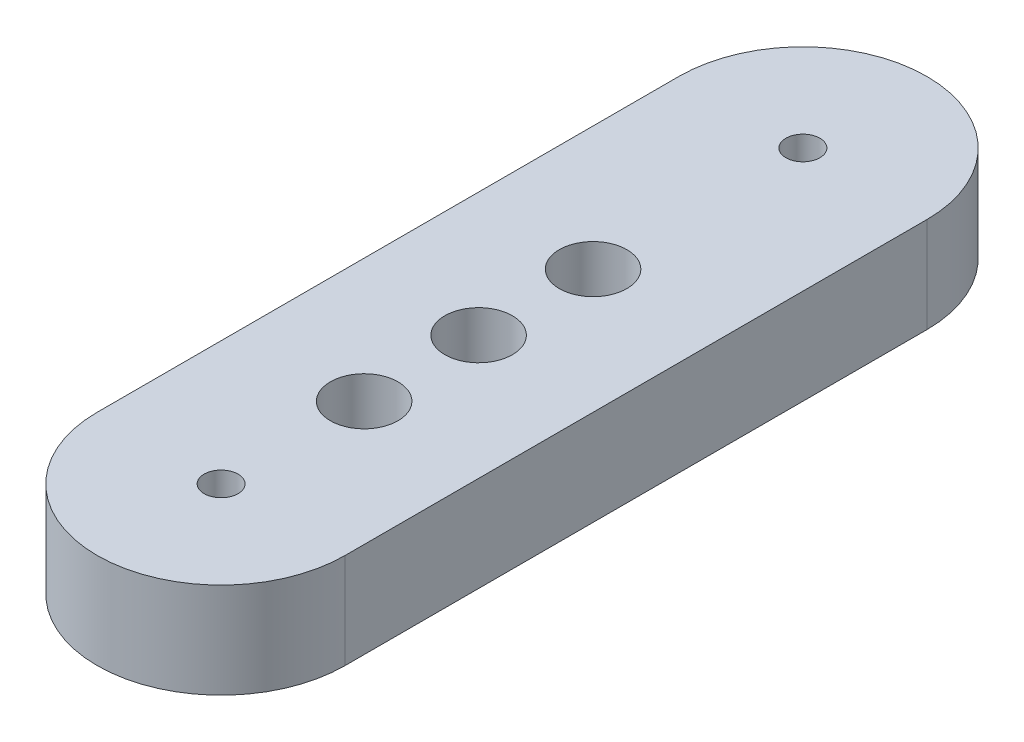
ISO-10303-21;
HEADER;
FILE_DESCRIPTION(('STEP AP214'),'2;1');
FILE_NAME('part.step','',(''),(''),'','','');
FILE_SCHEMA(('AUTOMOTIVE_DESIGN { 1 0 10303 214 1 1 1 1 }'));
ENDSEC;
DATA;
#1=APPLICATION_CONTEXT('core data for automotive mechanical design processes');
#2=APPLICATION_PROTOCOL_DEFINITION('international standard','automotive_design',2000,#1);
#3=PRODUCT_CONTEXT('',#1,'mechanical');
#4=PRODUCT('Part','Part','',(#3));
#5=PRODUCT_RELATED_PRODUCT_CATEGORY('part','',(#4));
#6=PRODUCT_DEFINITION_FORMATION('','',#4);
#7=PRODUCT_DEFINITION_CONTEXT('part definition',#1,'design');
#8=PRODUCT_DEFINITION('design','',#6,#7);
#9=PRODUCT_DEFINITION_SHAPE('','',#8);
#10=(LENGTH_UNIT() NAMED_UNIT(*) SI_UNIT(.MILLI.,.METRE.));
#11=(NAMED_UNIT(*) PLANE_ANGLE_UNIT() SI_UNIT($,.RADIAN.));
#12=(NAMED_UNIT(*) SI_UNIT($,.STERADIAN.) SOLID_ANGLE_UNIT());
#13=UNCERTAINTY_MEASURE_WITH_UNIT(LENGTH_MEASURE(1.E-05),#10,'distance_accuracy_value','');
#14=(GEOMETRIC_REPRESENTATION_CONTEXT(3) GLOBAL_UNCERTAINTY_ASSIGNED_CONTEXT((#13)) GLOBAL_UNIT_ASSIGNED_CONTEXT((#10,
#11,#12)) REPRESENTATION_CONTEXT('',''));
#15=CARTESIAN_POINT('',(0.,0.,0.));
#16=DIRECTION('',(0.,0.,1.));
#17=DIRECTION('',(1.,0.,0.));
#18=AXIS2_PLACEMENT_3D('',#15,#16,#17);
#19=CARTESIAN_POINT('',(0.,6.35,19.3675));
#20=DIRECTION('',(0.,1.,0.));
#21=DIRECTION('',(0.,0.,1.));
#22=AXIS2_PLACEMENT_3D('',#19,#20,#21);
#23=PLANE('',#22);
#24=CARTESIAN_POINT('',(0.,6.35,2.2225));
#25=DIRECTION('',(0.,1.,0.));
#26=DIRECTION('',(0.,0.,1.));
#27=AXIS2_PLACEMENT_3D('',#24,#25,#26);
#28=CIRCLE('',#27,2.25);
#29=CARTESIAN_POINT('',(0.,6.35,4.4725));
#30=VERTEX_POINT('',#29);
#31=EDGE_CURVE('E127',#30,#30,#28,.T.);
#32=ORIENTED_EDGE('',*,*,#31,.F.);
#33=EDGE_LOOP('',(#32));
#34=FACE_BOUND('',#33,.T.);
#35=CARTESIAN_POINT('',(0.,6.35,19.3675));
#36=DIRECTION('',(0.,1.,0.));
#37=DIRECTION('',(0.,0.,1.));
#38=AXIS2_PLACEMENT_3D('',#35,#36,#37);
#39=CIRCLE('',#38,1.1303);
#40=CARTESIAN_POINT('',(0.,6.35,20.4978));
#41=VERTEX_POINT('',#40);
#42=EDGE_CURVE('E115',#41,#41,#39,.T.);
#43=ORIENTED_EDGE('',*,*,#42,.F.);
#44=EDGE_LOOP('',(#43));
#45=FACE_BOUND('',#44,.T.);
#46=CARTESIAN_POINT('',(0.,6.35,19.3675));
#47=DIRECTION('',(0.,1.,0.));
#48=DIRECTION('',(0.,0.,1.));
#49=AXIS2_PLACEMENT_3D('',#46,#47,#48);
#50=CIRCLE('',#49,8.255);
#51=CARTESIAN_POINT('',(-8.255,6.35,19.3675));
#52=VERTEX_POINT('',#51);
#53=CARTESIAN_POINT('',(8.255,6.35,19.3675));
#54=VERTEX_POINT('',#53);
#55=EDGE_CURVE('E85',#52,#54,#50,.T.);
#56=ORIENTED_EDGE('',*,*,#55,.T.);
#57=DIRECTION('',(0.,0.,-1.));
#58=VECTOR('',#57,1.);
#59=CARTESIAN_POINT('',(8.255,6.35,19.3675));
#60=LINE('',#59,#58);
#61=CARTESIAN_POINT('',(8.255,6.35,-19.3675));
#62=VERTEX_POINT('',#61);
#63=EDGE_CURVE('E80',#54,#62,#60,.T.);
#64=ORIENTED_EDGE('',*,*,#63,.T.);
#65=CARTESIAN_POINT('',(0.,6.35,-19.3675));
#66=DIRECTION('',(0.,1.,0.));
#67=DIRECTION('',(0.,0.,1.));
#68=AXIS2_PLACEMENT_3D('',#65,#66,#67);
#69=CIRCLE('',#68,8.255);
#70=CARTESIAN_POINT('',(-8.25500000000001,6.35,-19.3675));
#71=VERTEX_POINT('',#70);
#72=EDGE_CURVE('E83',#62,#71,#69,.T.);
#73=ORIENTED_EDGE('',*,*,#72,.T.);
#74=DIRECTION('',(0.,0.,1.));
#75=VECTOR('',#74,1.);
#76=CARTESIAN_POINT('',(-8.255,6.35,19.3675));
#77=LINE('',#76,#75);
#78=EDGE_CURVE('E50',#71,#52,#77,.T.);
#79=ORIENTED_EDGE('',*,*,#78,.T.);
#80=EDGE_LOOP('',(#56,#64,#73,#79));
#81=FACE_BOUND('',#80,.T.);
#82=CARTESIAN_POINT('',(0.,6.35,-19.3675));
#83=DIRECTION('',(0.,1.,0.));
#84=DIRECTION('',(0.,0.,1.));
#85=AXIS2_PLACEMENT_3D('',#82,#83,#84);
#86=CIRCLE('',#85,1.1303);
#87=CARTESIAN_POINT('',(0.,6.35,-18.2372));
#88=VERTEX_POINT('',#87);
#89=EDGE_CURVE('E100',#88,#88,#86,.T.);
#90=ORIENTED_EDGE('',*,*,#89,.F.);
#91=EDGE_LOOP('',(#90));
#92=FACE_BOUND('',#91,.T.);
#93=CARTESIAN_POINT('',(0.,6.35,9.8425));
#94=DIRECTION('',(0.,1.,0.));
#95=DIRECTION('',(0.,0.,1.));
#96=AXIS2_PLACEMENT_3D('',#93,#94,#95);
#97=CIRCLE('',#96,2.25);
#98=CARTESIAN_POINT('',(0.,6.35,12.0925));
#99=VERTEX_POINT('',#98);
#100=EDGE_CURVE('E121',#99,#99,#97,.T.);
#101=ORIENTED_EDGE('',*,*,#100,.F.);
#102=EDGE_LOOP('',(#101));
#103=FACE_BOUND('',#102,.T.);
#104=CARTESIAN_POINT('',(0.,6.35,-5.3975));
#105=DIRECTION('',(0.,1.,0.));
#106=DIRECTION('',(0.,0.,1.));
#107=AXIS2_PLACEMENT_3D('',#104,#105,#106);
#108=CIRCLE('',#107,2.25);
#109=CARTESIAN_POINT('',(0.,6.35,-3.1475));
#110=VERTEX_POINT('',#109);
#111=EDGE_CURVE('E133',#110,#110,#108,.T.);
#112=ORIENTED_EDGE('',*,*,#111,.F.);
#113=EDGE_LOOP('',(#112));
#114=FACE_BOUND('',#113,.T.);
#115=ADVANCED_FACE('F33',(#34,#45,#81,#92,#103,#114),#23,.T.);
#116=CARTESIAN_POINT('',(0.,0.,19.3675));
#117=DIRECTION('',(0.,1.,0.));
#118=DIRECTION('',(0.,0.,1.));
#119=AXIS2_PLACEMENT_3D('',#116,#117,#118);
#120=PLANE('',#119);
#121=CARTESIAN_POINT('',(0.,0.,2.2225));
#122=DIRECTION('',(0.,1.,0.));
#123=DIRECTION('',(0.,0.,1.));
#124=AXIS2_PLACEMENT_3D('',#121,#122,#123);
#125=CIRCLE('',#124,2.25);
#126=CARTESIAN_POINT('',(0.,0.,4.4725));
#127=VERTEX_POINT('',#126);
#128=EDGE_CURVE('E130',#127,#127,#125,.T.);
#129=ORIENTED_EDGE('',*,*,#128,.T.);
#130=EDGE_LOOP('',(#129));
#131=FACE_BOUND('',#130,.T.);
#132=CARTESIAN_POINT('',(0.,0.,19.3675));
#133=DIRECTION('',(0.,1.,0.));
#134=DIRECTION('',(0.,0.,1.));
#135=AXIS2_PLACEMENT_3D('',#132,#133,#134);
#136=CIRCLE('',#135,1.1303);
#137=CARTESIAN_POINT('',(0.,0.,20.4978));
#138=VERTEX_POINT('',#137);
#139=EDGE_CURVE('E118',#138,#138,#136,.T.);
#140=ORIENTED_EDGE('',*,*,#139,.T.);
#141=EDGE_LOOP('',(#140));
#142=FACE_BOUND('',#141,.T.);
#143=CARTESIAN_POINT('',(0.,0.,19.3675));
#144=DIRECTION('',(0.,1.,0.));
#145=DIRECTION('',(0.,0.,1.));
#146=AXIS2_PLACEMENT_3D('',#143,#144,#145);
#147=CIRCLE('',#146,8.255);
#148=CARTESIAN_POINT('',(-8.255,0.,19.3675));
#149=VERTEX_POINT('',#148);
#150=CARTESIAN_POINT('',(8.255,0.,19.3675));
#151=VERTEX_POINT('',#150);
#152=EDGE_CURVE('E97',#149,#151,#147,.T.);
#153=ORIENTED_EDGE('',*,*,#152,.F.);
#154=DIRECTION('',(0.,0.,1.));
#155=VECTOR('',#154,1.);
#156=CARTESIAN_POINT('',(-8.255,0.,19.3675));
#157=LINE('',#156,#155);
#158=CARTESIAN_POINT('',(-8.25500000000001,0.,-19.3675));
#159=VERTEX_POINT('',#158);
#160=EDGE_CURVE('E73',#159,#149,#157,.T.);
#161=ORIENTED_EDGE('',*,*,#160,.F.);
#162=CARTESIAN_POINT('',(0.,0.,-19.3675));
#163=DIRECTION('',(0.,1.,0.));
#164=DIRECTION('',(0.,0.,1.));
#165=AXIS2_PLACEMENT_3D('',#162,#163,#164);
#166=CIRCLE('',#165,8.255);
#167=CARTESIAN_POINT('',(8.255,0.,-19.3675));
#168=VERTEX_POINT('',#167);
#169=EDGE_CURVE('E67',#168,#159,#166,.T.);
#170=ORIENTED_EDGE('',*,*,#169,.F.);
#171=DIRECTION('',(0.,0.,-1.));
#172=VECTOR('',#171,1.);
#173=CARTESIAN_POINT('',(8.255,0.,19.3675));
#174=LINE('',#173,#172);
#175=EDGE_CURVE('E89',#151,#168,#174,.T.);
#176=ORIENTED_EDGE('',*,*,#175,.F.);
#177=EDGE_LOOP('',(#153,#161,#170,#176));
#178=FACE_BOUND('',#177,.T.);
#179=CARTESIAN_POINT('',(0.,0.,-19.3675));
#180=DIRECTION('',(0.,1.,0.));
#181=DIRECTION('',(0.,0.,1.));
#182=AXIS2_PLACEMENT_3D('',#179,#180,#181);
#183=CIRCLE('',#182,1.1303);
#184=CARTESIAN_POINT('',(0.,0.,-18.2372));
#185=VERTEX_POINT('',#184);
#186=EDGE_CURVE('E112',#185,#185,#183,.T.);
#187=ORIENTED_EDGE('',*,*,#186,.T.);
#188=EDGE_LOOP('',(#187));
#189=FACE_BOUND('',#188,.T.);
#190=CARTESIAN_POINT('',(0.,0.,9.8425));
#191=DIRECTION('',(0.,1.,0.));
#192=DIRECTION('',(0.,0.,1.));
#193=AXIS2_PLACEMENT_3D('',#190,#191,#192);
#194=CIRCLE('',#193,2.25);
#195=CARTESIAN_POINT('',(0.,0.,12.0925));
#196=VERTEX_POINT('',#195);
#197=EDGE_CURVE('E124',#196,#196,#194,.T.);
#198=ORIENTED_EDGE('',*,*,#197,.T.);
#199=EDGE_LOOP('',(#198));
#200=FACE_BOUND('',#199,.T.);
#201=CARTESIAN_POINT('',(0.,0.,-5.3975));
#202=DIRECTION('',(0.,1.,0.));
#203=DIRECTION('',(0.,0.,1.));
#204=AXIS2_PLACEMENT_3D('',#201,#202,#203);
#205=CIRCLE('',#204,2.25);
#206=CARTESIAN_POINT('',(0.,0.,-3.1475));
#207=VERTEX_POINT('',#206);
#208=EDGE_CURVE('E136',#207,#207,#205,.T.);
#209=ORIENTED_EDGE('',*,*,#208,.T.);
#210=EDGE_LOOP('',(#209));
#211=FACE_BOUND('',#210,.T.);
#212=ADVANCED_FACE('F108',(#131,#142,#178,#189,#200,#211),#120,.F.);
#213=CARTESIAN_POINT('',(0.,6.35,19.3675));
#214=DIRECTION('',(0.,-1.,0.));
#215=DIRECTION('',(0.,0.,-1.));
#216=AXIS2_PLACEMENT_3D('',#213,#214,#215);
#217=CYLINDRICAL_SURFACE('',#216,8.255);
#218=ORIENTED_EDGE('',*,*,#152,.T.);
#219=DIRECTION('',(0.,-1.,0.));
#220=VECTOR('',#219,1.);
#221=CARTESIAN_POINT('',(8.255,6.35,19.3675));
#222=LINE('',#221,#220);
#223=EDGE_CURVE('E11',#54,#151,#222,.T.);
#224=ORIENTED_EDGE('',*,*,#223,.F.);
#225=ORIENTED_EDGE('',*,*,#55,.F.);
#226=DIRECTION('',(0.,-1.,0.));
#227=VECTOR('',#226,1.);
#228=CARTESIAN_POINT('',(-8.255,6.35,19.3675));
#229=LINE('',#228,#227);
#230=EDGE_CURVE('E93',#52,#149,#229,.T.);
#231=ORIENTED_EDGE('',*,*,#230,.T.);
#232=EDGE_LOOP('',(#218,#224,#225,#231));
#233=FACE_BOUND('',#232,.T.);
#234=ADVANCED_FACE('F35',(#233),#217,.T.);
#235=CARTESIAN_POINT('',(8.255,6.35,19.3675));
#236=DIRECTION('',(-1.,0.,0.));
#237=DIRECTION('',(0.,0.,1.));
#238=AXIS2_PLACEMENT_3D('',#235,#236,#237);
#239=PLANE('',#238);
#240=ORIENTED_EDGE('',*,*,#175,.T.);
#241=DIRECTION('',(0.,-1.,0.));
#242=VECTOR('',#241,1.);
#243=CARTESIAN_POINT('',(8.255,6.35,-19.3675));
#244=LINE('',#243,#242);
#245=EDGE_CURVE('E42',#62,#168,#244,.T.);
#246=ORIENTED_EDGE('',*,*,#245,.F.);
#247=ORIENTED_EDGE('',*,*,#63,.F.);
#248=ORIENTED_EDGE('',*,*,#223,.T.);
#249=EDGE_LOOP('',(#240,#246,#247,#248));
#250=FACE_BOUND('',#249,.T.);
#251=ADVANCED_FACE('F88',(#250),#239,.F.);
#252=CARTESIAN_POINT('',(0.,6.35,-19.3675));
#253=DIRECTION('',(0.,-1.,0.));
#254=DIRECTION('',(0.,0.,-1.));
#255=AXIS2_PLACEMENT_3D('',#252,#253,#254);
#256=CYLINDRICAL_SURFACE('',#255,8.255);
#257=ORIENTED_EDGE('',*,*,#169,.T.);
#258=DIRECTION('',(0.,-1.,0.));
#259=VECTOR('',#258,1.);
#260=CARTESIAN_POINT('',(-8.25500000000001,6.35,-19.3675));
#261=LINE('',#260,#259);
#262=EDGE_CURVE('E90',#71,#159,#261,.T.);
#263=ORIENTED_EDGE('',*,*,#262,.F.);
#264=ORIENTED_EDGE('',*,*,#72,.F.);
#265=ORIENTED_EDGE('',*,*,#245,.T.);
#266=EDGE_LOOP('',(#257,#263,#264,#265));
#267=FACE_BOUND('',#266,.T.);
#268=ADVANCED_FACE('F91',(#267),#256,.T.);
#269=CARTESIAN_POINT('',(-8.255,6.35,19.3675));
#270=DIRECTION('',(1.,0.,0.));
#271=DIRECTION('',(0.,0.,-1.));
#272=AXIS2_PLACEMENT_3D('',#269,#270,#271);
#273=PLANE('',#272);
#274=ORIENTED_EDGE('',*,*,#160,.T.);
#275=ORIENTED_EDGE('',*,*,#230,.F.);
#276=ORIENTED_EDGE('',*,*,#78,.F.);
#277=ORIENTED_EDGE('',*,*,#262,.T.);
#278=EDGE_LOOP('',(#274,#275,#276,#277));
#279=FACE_BOUND('',#278,.T.);
#280=ADVANCED_FACE('F105',(#279),#273,.F.);
#281=CARTESIAN_POINT('',(0.,6.35,-19.3675));
#282=DIRECTION('',(0.,-1.,0.));
#283=DIRECTION('',(0.,0.,-1.));
#284=AXIS2_PLACEMENT_3D('',#281,#282,#283);
#285=CYLINDRICAL_SURFACE('',#284,1.1303);
#286=ORIENTED_EDGE('',*,*,#89,.T.);
#287=EDGE_LOOP('',(#286));
#288=FACE_BOUND('',#287,.T.);
#289=ORIENTED_EDGE('',*,*,#186,.F.);
#290=EDGE_LOOP('',(#289));
#291=FACE_BOUND('',#290,.T.);
#292=ADVANCED_FACE('F156',(#288,#291),#285,.F.);
#293=CARTESIAN_POINT('',(0.,6.35,19.3675));
#294=DIRECTION('',(0.,-1.,0.));
#295=DIRECTION('',(0.,0.,-1.));
#296=AXIS2_PLACEMENT_3D('',#293,#294,#295);
#297=CYLINDRICAL_SURFACE('',#296,1.1303);
#298=ORIENTED_EDGE('',*,*,#42,.T.);
#299=EDGE_LOOP('',(#298));
#300=FACE_BOUND('',#299,.T.);
#301=ORIENTED_EDGE('',*,*,#139,.F.);
#302=EDGE_LOOP('',(#301));
#303=FACE_BOUND('',#302,.T.);
#304=ADVANCED_FACE('F202',(#300,#303),#297,.F.);
#305=CARTESIAN_POINT('',(0.,6.35,9.8425));
#306=DIRECTION('',(0.,-1.,0.));
#307=DIRECTION('',(0.,0.,-1.));
#308=AXIS2_PLACEMENT_3D('',#305,#306,#307);
#309=CYLINDRICAL_SURFACE('',#308,2.25);
#310=ORIENTED_EDGE('',*,*,#100,.T.);
#311=EDGE_LOOP('',(#310));
#312=FACE_BOUND('',#311,.T.);
#313=ORIENTED_EDGE('',*,*,#197,.F.);
#314=EDGE_LOOP('',(#313));
#315=FACE_BOUND('',#314,.T.);
#316=ADVANCED_FACE('F210',(#312,#315),#309,.F.);
#317=CARTESIAN_POINT('',(0.,6.35,2.2225));
#318=DIRECTION('',(0.,-1.,0.));
#319=DIRECTION('',(0.,0.,-1.));
#320=AXIS2_PLACEMENT_3D('',#317,#318,#319);
#321=CYLINDRICAL_SURFACE('',#320,2.25);
#322=ORIENTED_EDGE('',*,*,#31,.T.);
#323=EDGE_LOOP('',(#322));
#324=FACE_BOUND('',#323,.T.);
#325=ORIENTED_EDGE('',*,*,#128,.F.);
#326=EDGE_LOOP('',(#325));
#327=FACE_BOUND('',#326,.T.);
#328=ADVANCED_FACE('F218',(#324,#327),#321,.F.);
#329=CARTESIAN_POINT('',(0.,6.35,-5.3975));
#330=DIRECTION('',(0.,-1.,0.));
#331=DIRECTION('',(0.,0.,-1.));
#332=AXIS2_PLACEMENT_3D('',#329,#330,#331);
#333=CYLINDRICAL_SURFACE('',#332,2.25);
#334=ORIENTED_EDGE('',*,*,#111,.T.);
#335=EDGE_LOOP('',(#334));
#336=FACE_BOUND('',#335,.T.);
#337=ORIENTED_EDGE('',*,*,#208,.F.);
#338=EDGE_LOOP('',(#337));
#339=FACE_BOUND('',#338,.T.);
#340=ADVANCED_FACE('F142',(#336,#339),#333,.F.);
#341=CLOSED_SHELL('',(#115,#212,#234,#251,#268,#280,#292,#304,#316,#328,#340));
#342=MANIFOLD_SOLID_BREP('B2',#341);
#343=ADVANCED_BREP_SHAPE_REPRESENTATION('',(#18,#342),#14);
#344=SHAPE_DEFINITION_REPRESENTATION(#9,#343);
ENDSEC;
END-ISO-10303-21;
